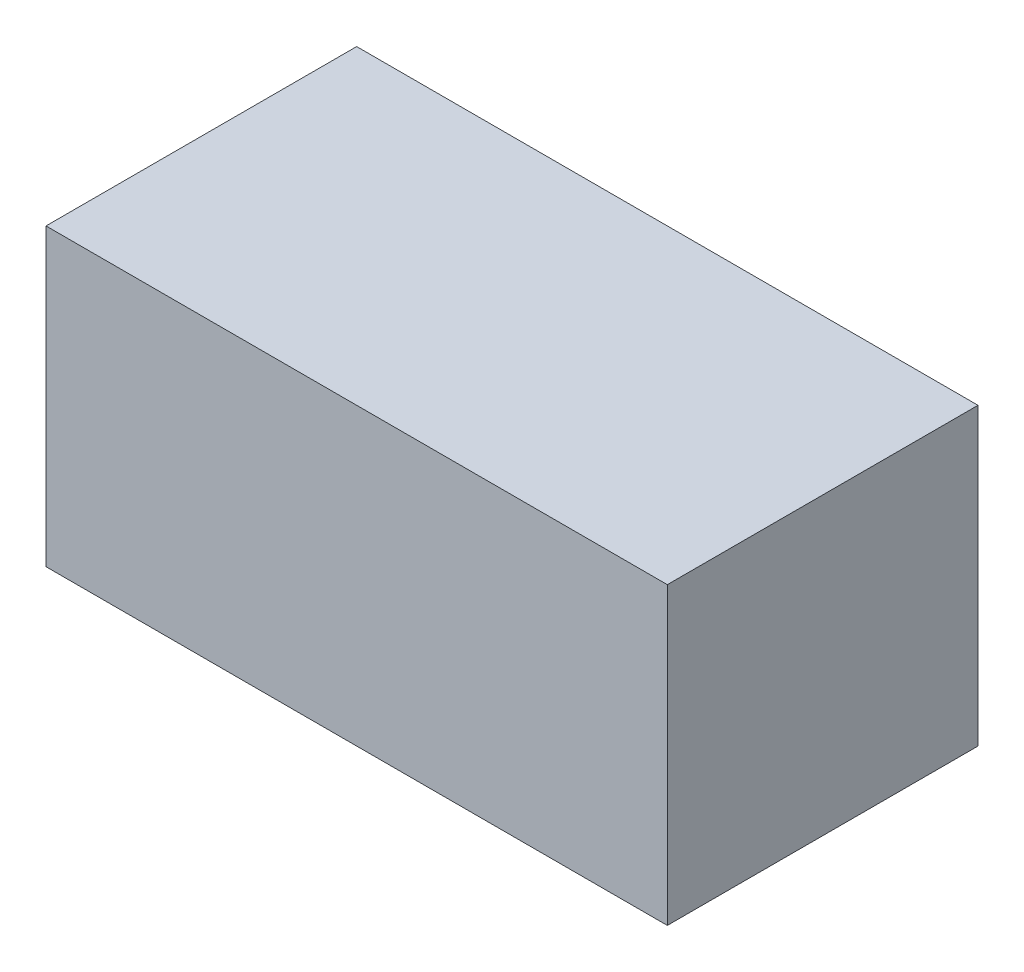
ISO-10303-21;
HEADER;
FILE_DESCRIPTION(('STEP AP214'),'2;1');
FILE_NAME('part.step','',(''),(''),'','','');
FILE_SCHEMA(('AUTOMOTIVE_DESIGN { 1 0 10303 214 1 1 1 1 }'));
ENDSEC;
DATA;
#1=APPLICATION_CONTEXT('core data for automotive mechanical design processes');
#2=APPLICATION_PROTOCOL_DEFINITION('international standard','automotive_design',2000,#1);
#3=PRODUCT_CONTEXT('',#1,'mechanical');
#4=PRODUCT('Part','Part','',(#3));
#5=PRODUCT_RELATED_PRODUCT_CATEGORY('part','',(#4));
#6=PRODUCT_DEFINITION_FORMATION('','',#4);
#7=PRODUCT_DEFINITION_CONTEXT('part definition',#1,'design');
#8=PRODUCT_DEFINITION('design','',#6,#7);
#9=PRODUCT_DEFINITION_SHAPE('','',#8);
#10=(LENGTH_UNIT() NAMED_UNIT(*) SI_UNIT(.MILLI.,.METRE.));
#11=(NAMED_UNIT(*) PLANE_ANGLE_UNIT() SI_UNIT($,.RADIAN.));
#12=(NAMED_UNIT(*) SI_UNIT($,.STERADIAN.) SOLID_ANGLE_UNIT());
#13=UNCERTAINTY_MEASURE_WITH_UNIT(LENGTH_MEASURE(1.E-05),#10,'distance_accuracy_value','');
#14=(GEOMETRIC_REPRESENTATION_CONTEXT(3) GLOBAL_UNCERTAINTY_ASSIGNED_CONTEXT((#13)) GLOBAL_UNIT_ASSIGNED_CONTEXT((#10,
#11,#12)) REPRESENTATION_CONTEXT('',''));
#15=CARTESIAN_POINT('',(0.,0.,0.));
#16=DIRECTION('',(0.,0.,1.));
#17=DIRECTION('',(1.,0.,0.));
#18=AXIS2_PLACEMENT_3D('',#15,#16,#17);
#19=CARTESIAN_POINT('',(0.,-19.,0.));
#20=DIRECTION('',(-1.,0.,0.));
#21=DIRECTION('',(0.,0.,1.));
#22=AXIS2_PLACEMENT_3D('',#19,#20,#21);
#23=PLANE('',#22);
#24=DIRECTION('',(0.,0.,1.));
#25=VECTOR('',#24,1.);
#26=CARTESIAN_POINT('',(0.,0.,0.));
#27=LINE('',#26,#25);
#28=CARTESIAN_POINT('',(0.,0.,-20.));
#29=VERTEX_POINT('',#28);
#30=CARTESIAN_POINT('',(0.,0.,0.));
#31=VERTEX_POINT('',#30);
#32=EDGE_CURVE('E104',#29,#31,#27,.T.);
#33=ORIENTED_EDGE('',*,*,#32,.F.);
#34=DIRECTION('',(0.,1.,0.));
#35=VECTOR('',#34,1.);
#36=CARTESIAN_POINT('',(0.,-19.,-20.));
#37=LINE('',#36,#35);
#38=CARTESIAN_POINT('',(0.,-19.,-20.));
#39=VERTEX_POINT('',#38);
#40=EDGE_CURVE('E11',#39,#29,#37,.T.);
#41=ORIENTED_EDGE('',*,*,#40,.F.);
#42=DIRECTION('',(0.,0.,1.));
#43=VECTOR('',#42,1.);
#44=CARTESIAN_POINT('',(0.,-19.,0.));
#45=LINE('',#44,#43);
#46=CARTESIAN_POINT('',(0.,-19.,0.));
#47=VERTEX_POINT('',#46);
#48=EDGE_CURVE('E100',#39,#47,#45,.T.);
#49=ORIENTED_EDGE('',*,*,#48,.T.);
#50=DIRECTION('',(0.,1.,0.));
#51=VECTOR('',#50,1.);
#52=CARTESIAN_POINT('',(0.,-19.,0.));
#53=LINE('',#52,#51);
#54=EDGE_CURVE('E45',#47,#31,#53,.T.);
#55=ORIENTED_EDGE('',*,*,#54,.T.);
#56=EDGE_LOOP('',(#33,#41,#49,#55));
#57=FACE_BOUND('',#56,.T.);
#58=ADVANCED_FACE('F39',(#57),#23,.T.);
#59=CARTESIAN_POINT('',(0.,-19.,-20.));
#60=DIRECTION('',(0.,0.,-1.));
#61=DIRECTION('',(-1.,0.,0.));
#62=AXIS2_PLACEMENT_3D('',#59,#60,#61);
#63=PLANE('',#62);
#64=DIRECTION('',(-1.,0.,0.));
#65=VECTOR('',#64,1.);
#66=CARTESIAN_POINT('',(0.,0.,-20.));
#67=LINE('',#66,#65);
#68=CARTESIAN_POINT('',(40.,0.,-20.));
#69=VERTEX_POINT('',#68);
#70=EDGE_CURVE('E98',#69,#29,#67,.T.);
#71=ORIENTED_EDGE('',*,*,#70,.F.);
#72=DIRECTION('',(0.,1.,0.));
#73=VECTOR('',#72,1.);
#74=CARTESIAN_POINT('',(40.,-19.,-20.));
#75=LINE('',#74,#73);
#76=CARTESIAN_POINT('',(40.,-19.,-20.));
#77=VERTEX_POINT('',#76);
#78=EDGE_CURVE('E48',#77,#69,#75,.T.);
#79=ORIENTED_EDGE('',*,*,#78,.F.);
#80=DIRECTION('',(-1.,0.,0.));
#81=VECTOR('',#80,1.);
#82=CARTESIAN_POINT('',(0.,-19.,-20.));
#83=LINE('',#82,#81);
#84=EDGE_CURVE('E92',#77,#39,#83,.T.);
#85=ORIENTED_EDGE('',*,*,#84,.T.);
#86=ORIENTED_EDGE('',*,*,#40,.T.);
#87=EDGE_LOOP('',(#71,#79,#85,#86));
#88=FACE_BOUND('',#87,.T.);
#89=ADVANCED_FACE('F111',(#88),#63,.T.);
#90=CARTESIAN_POINT('',(40.,-19.,0.));
#91=DIRECTION('',(1.,0.,0.));
#92=DIRECTION('',(0.,0.,-1.));
#93=AXIS2_PLACEMENT_3D('',#90,#91,#92);
#94=PLANE('',#93);
#95=DIRECTION('',(0.,0.,-1.));
#96=VECTOR('',#95,1.);
#97=CARTESIAN_POINT('',(40.,0.,0.));
#98=LINE('',#97,#96);
#99=CARTESIAN_POINT('',(40.,0.,0.));
#100=VERTEX_POINT('',#99);
#101=EDGE_CURVE('E87',#100,#69,#98,.T.);
#102=ORIENTED_EDGE('',*,*,#101,.F.);
#103=DIRECTION('',(0.,1.,0.));
#104=VECTOR('',#103,1.);
#105=CARTESIAN_POINT('',(40.,-19.,0.));
#106=LINE('',#105,#104);
#107=CARTESIAN_POINT('',(40.,-19.,0.));
#108=VERTEX_POINT('',#107);
#109=EDGE_CURVE('E84',#108,#100,#106,.T.);
#110=ORIENTED_EDGE('',*,*,#109,.F.);
#111=DIRECTION('',(0.,0.,-1.));
#112=VECTOR('',#111,1.);
#113=CARTESIAN_POINT('',(40.,-19.,0.));
#114=LINE('',#113,#112);
#115=EDGE_CURVE('E90',#108,#77,#114,.T.);
#116=ORIENTED_EDGE('',*,*,#115,.T.);
#117=ORIENTED_EDGE('',*,*,#78,.T.);
#118=EDGE_LOOP('',(#102,#110,#116,#117));
#119=FACE_BOUND('',#118,.T.);
#120=ADVANCED_FACE('F86',(#119),#94,.T.);
#121=CARTESIAN_POINT('',(0.,-19.,0.));
#122=DIRECTION('',(0.,0.,1.));
#123=DIRECTION('',(1.,0.,0.));
#124=AXIS2_PLACEMENT_3D('',#121,#122,#123);
#125=PLANE('',#124);
#126=DIRECTION('',(1.,0.,0.));
#127=VECTOR('',#126,1.);
#128=CARTESIAN_POINT('',(0.,0.,0.));
#129=LINE('',#128,#127);
#130=EDGE_CURVE('E106',#31,#100,#129,.T.);
#131=ORIENTED_EDGE('',*,*,#130,.F.);
#132=ORIENTED_EDGE('',*,*,#54,.F.);
#133=DIRECTION('',(1.,0.,0.));
#134=VECTOR('',#133,1.);
#135=CARTESIAN_POINT('',(0.,-19.,0.));
#136=LINE('',#135,#134);
#137=EDGE_CURVE('E93',#47,#108,#136,.T.);
#138=ORIENTED_EDGE('',*,*,#137,.T.);
#139=ORIENTED_EDGE('',*,*,#109,.T.);
#140=EDGE_LOOP('',(#131,#132,#138,#139));
#141=FACE_BOUND('',#140,.T.);
#142=ADVANCED_FACE('F96',(#141),#125,.T.);
#143=CARTESIAN_POINT('',(0.,-19.,0.));
#144=DIRECTION('',(0.,-1.,0.));
#145=DIRECTION('',(0.,0.,-1.));
#146=AXIS2_PLACEMENT_3D('',#143,#144,#145);
#147=PLANE('',#146);
#148=ORIENTED_EDGE('',*,*,#48,.F.);
#149=ORIENTED_EDGE('',*,*,#84,.F.);
#150=ORIENTED_EDGE('',*,*,#115,.F.);
#151=ORIENTED_EDGE('',*,*,#137,.F.);
#152=EDGE_LOOP('',(#148,#149,#150,#151));
#153=FACE_BOUND('',#152,.T.);
#154=ADVANCED_FACE('F95',(#153),#147,.T.);
#155=CARTESIAN_POINT('',(0.,0.,0.));
#156=DIRECTION('',(0.,-1.,0.));
#157=DIRECTION('',(0.,0.,-1.));
#158=AXIS2_PLACEMENT_3D('',#155,#156,#157);
#159=PLANE('',#158);
#160=ORIENTED_EDGE('',*,*,#32,.T.);
#161=ORIENTED_EDGE('',*,*,#130,.T.);
#162=ORIENTED_EDGE('',*,*,#101,.T.);
#163=ORIENTED_EDGE('',*,*,#70,.T.);
#164=EDGE_LOOP('',(#160,#161,#162,#163));
#165=FACE_BOUND('',#164,.T.);
#166=ADVANCED_FACE('F115',(#165),#159,.F.);
#167=CLOSED_SHELL('',(#58,#89,#120,#142,#154,#166));
#168=MANIFOLD_SOLID_BREP('B2',#167);
#169=ADVANCED_BREP_SHAPE_REPRESENTATION('',(#18,#168),#14);
#170=SHAPE_DEFINITION_REPRESENTATION(#9,#169);
ENDSEC;
END-ISO-10303-21;
